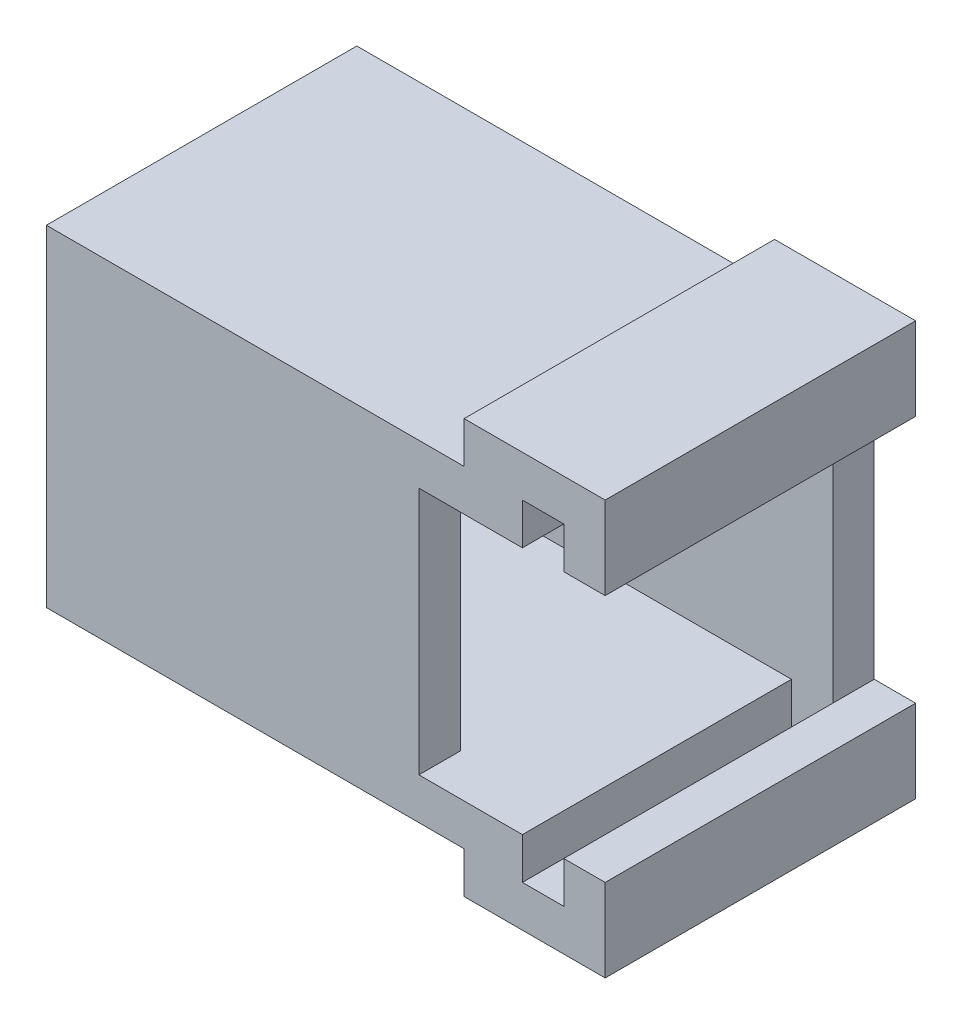
ISO-10303-21;
HEADER;
FILE_DESCRIPTION(('STEP AP214'),'2;1');
FILE_NAME('part.step','',(''),(''),'','','');
FILE_SCHEMA(('AUTOMOTIVE_DESIGN { 1 0 10303 214 1 1 1 1 }'));
ENDSEC;
DATA;
#1=APPLICATION_CONTEXT('core data for automotive mechanical design processes');
#2=APPLICATION_PROTOCOL_DEFINITION('international standard','automotive_design',2000,#1);
#3=PRODUCT_CONTEXT('',#1,'mechanical');
#4=PRODUCT('Part','Part','',(#3));
#5=PRODUCT_RELATED_PRODUCT_CATEGORY('part','',(#4));
#6=PRODUCT_DEFINITION_FORMATION('','',#4);
#7=PRODUCT_DEFINITION_CONTEXT('part definition',#1,'design');
#8=PRODUCT_DEFINITION('design','',#6,#7);
#9=PRODUCT_DEFINITION_SHAPE('','',#8);
#10=(LENGTH_UNIT() NAMED_UNIT(*) SI_UNIT(.MILLI.,.METRE.));
#11=(NAMED_UNIT(*) PLANE_ANGLE_UNIT() SI_UNIT($,.RADIAN.));
#12=(NAMED_UNIT(*) SI_UNIT($,.STERADIAN.) SOLID_ANGLE_UNIT());
#13=UNCERTAINTY_MEASURE_WITH_UNIT(LENGTH_MEASURE(1.E-05),#10,'distance_accuracy_value','');
#14=(GEOMETRIC_REPRESENTATION_CONTEXT(3) GLOBAL_UNCERTAINTY_ASSIGNED_CONTEXT((#13)) GLOBAL_UNIT_ASSIGNED_CONTEXT((#10,
#11,#12)) REPRESENTATION_CONTEXT('',''));
#15=CARTESIAN_POINT('',(0.,0.,0.));
#16=DIRECTION('',(0.,0.,1.));
#17=DIRECTION('',(1.,0.,0.));
#18=AXIS2_PLACEMENT_3D('',#15,#16,#17);
#19=CARTESIAN_POINT('',(23.,0.,15.));
#20=DIRECTION('',(-1.,0.,0.));
#21=DIRECTION('',(0.,0.,1.));
#22=AXIS2_PLACEMENT_3D('',#19,#20,#21);
#23=PLANE('',#22);
#24=DIRECTION('',(0.,1.,0.));
#25=VECTOR('',#24,1.);
#26=CARTESIAN_POINT('',(23.,0.,2.));
#27=LINE('',#26,#25);
#28=CARTESIAN_POINT('',(23.,14.,2.));
#29=VERTEX_POINT('',#28);
#30=CARTESIAN_POINT('',(23.,16.,2.));
#31=VERTEX_POINT('',#30);
#32=EDGE_CURVE('E192',#29,#31,#27,.T.);
#33=ORIENTED_EDGE('',*,*,#32,.T.);
#34=DIRECTION('',(0.,0.,-1.));
#35=VECTOR('',#34,1.);
#36=CARTESIAN_POINT('',(23.,16.,15.));
#37=LINE('',#36,#35);
#38=CARTESIAN_POINT('',(23.,16.,15.));
#39=VERTEX_POINT('',#38);
#40=EDGE_CURVE('E206',#39,#31,#37,.T.);
#41=ORIENTED_EDGE('',*,*,#40,.F.);
#42=DIRECTION('',(0.,1.,0.));
#43=VECTOR('',#42,1.);
#44=CARTESIAN_POINT('',(23.,0.,15.));
#45=LINE('',#44,#43);
#46=CARTESIAN_POINT('',(23.,14.,15.));
#47=VERTEX_POINT('',#46);
#48=EDGE_CURVE('E235',#47,#39,#45,.T.);
#49=ORIENTED_EDGE('',*,*,#48,.F.);
#50=DIRECTION('',(0.,0.,1.));
#51=VECTOR('',#50,1.);
#52=CARTESIAN_POINT('',(23.,14.,13.));
#53=LINE('',#52,#51);
#54=EDGE_CURVE('E208',#29,#47,#53,.T.);
#55=ORIENTED_EDGE('',*,*,#54,.F.);
#56=EDGE_LOOP('',(#33,#41,#49,#55));
#57=FACE_BOUND('',#56,.T.);
#58=ADVANCED_FACE('F33',(#57),#23,.F.);
#59=CARTESIAN_POINT('',(23.,0.,2.));
#60=VERTEX_POINT('',#59);
#61=CARTESIAN_POINT('',(23.,2.,2.));
#62=VERTEX_POINT('',#61);
#63=EDGE_CURVE('E200',#60,#62,#27,.T.);
#64=ORIENTED_EDGE('',*,*,#63,.T.);
#65=DIRECTION('',(0.,0.,-1.));
#66=VECTOR('',#65,1.);
#67=CARTESIAN_POINT('',(23.,2.,13.));
#68=LINE('',#67,#66);
#69=CARTESIAN_POINT('',(23.,2.,15.));
#70=VERTEX_POINT('',#69);
#71=EDGE_CURVE('E252',#70,#62,#68,.T.);
#72=ORIENTED_EDGE('',*,*,#71,.F.);
#73=CARTESIAN_POINT('',(23.,0.,15.));
#74=VERTEX_POINT('',#73);
#75=EDGE_CURVE('E232',#74,#70,#45,.T.);
#76=ORIENTED_EDGE('',*,*,#75,.F.);
#77=DIRECTION('',(0.,0.,-1.));
#78=VECTOR('',#77,1.);
#79=CARTESIAN_POINT('',(23.,0.,15.));
#80=LINE('',#79,#78);
#81=EDGE_CURVE('E42',#74,#60,#80,.T.);
#82=ORIENTED_EDGE('',*,*,#81,.T.);
#83=EDGE_LOOP('',(#64,#72,#76,#82));
#84=FACE_BOUND('',#83,.T.);
#85=ADVANCED_FACE('F375',(#84),#23,.F.);
#86=CARTESIAN_POINT('',(25.,16.,0.));
#87=DIRECTION('',(0.,-1.,0.));
#88=DIRECTION('',(0.,0.,-1.));
#89=AXIS2_PLACEMENT_3D('',#86,#87,#88);
#90=PLANE('',#89);
#91=ORIENTED_EDGE('',*,*,#40,.T.);
#92=DIRECTION('',(1.,0.,0.));
#93=VECTOR('',#92,1.);
#94=CARTESIAN_POINT('',(23.,16.,2.));
#95=LINE('',#94,#93);
#96=CARTESIAN_POINT('',(25.,16.,2.));
#97=VERTEX_POINT('',#96);
#98=EDGE_CURVE('E188',#31,#97,#95,.T.);
#99=ORIENTED_EDGE('',*,*,#98,.T.);
#100=DIRECTION('',(0.,0.,1.));
#101=VECTOR('',#100,1.);
#102=CARTESIAN_POINT('',(25.,16.,0.));
#103=LINE('',#102,#101);
#104=CARTESIAN_POINT('',(25.,16.,15.));
#105=VERTEX_POINT('',#104);
#106=EDGE_CURVE('E285',#97,#105,#103,.T.);
#107=ORIENTED_EDGE('',*,*,#106,.T.);
#108=DIRECTION('',(1.,0.,0.));
#109=VECTOR('',#108,1.);
#110=CARTESIAN_POINT('',(25.,16.,15.));
#111=LINE('',#110,#109);
#112=EDGE_CURVE('E213',#39,#105,#111,.T.);
#113=ORIENTED_EDGE('',*,*,#112,.F.);
#114=EDGE_LOOP('',(#91,#99,#107,#113));
#115=FACE_BOUND('',#114,.T.);
#116=ADVANCED_FACE('F211',(#115),#90,.T.);
#117=CARTESIAN_POINT('',(25.,14.,0.));
#118=DIRECTION('',(-1.,0.,0.));
#119=DIRECTION('',(0.,0.,1.));
#120=AXIS2_PLACEMENT_3D('',#117,#118,#119);
#121=PLANE('',#120);
#122=ORIENTED_EDGE('',*,*,#106,.F.);
#123=DIRECTION('',(0.,-1.,0.));
#124=VECTOR('',#123,1.);
#125=CARTESIAN_POINT('',(25.,0.,2.));
#126=LINE('',#125,#124);
#127=CARTESIAN_POINT('',(25.,14.,2.));
#128=VERTEX_POINT('',#127);
#129=EDGE_CURVE('E195',#97,#128,#126,.T.);
#130=ORIENTED_EDGE('',*,*,#129,.T.);
#131=DIRECTION('',(0.,0.,1.));
#132=VECTOR('',#131,1.);
#133=CARTESIAN_POINT('',(25.,14.,0.));
#134=LINE('',#133,#132);
#135=CARTESIAN_POINT('',(25.,14.,15.));
#136=VERTEX_POINT('',#135);
#137=EDGE_CURVE('E287',#128,#136,#134,.T.);
#138=ORIENTED_EDGE('',*,*,#137,.T.);
#139=DIRECTION('',(0.,-1.,0.));
#140=VECTOR('',#139,1.);
#141=CARTESIAN_POINT('',(25.,14.,15.));
#142=LINE('',#141,#140);
#143=EDGE_CURVE('E312',#105,#136,#142,.T.);
#144=ORIENTED_EDGE('',*,*,#143,.F.);
#145=EDGE_LOOP('',(#122,#130,#138,#144));
#146=FACE_BOUND('',#145,.T.);
#147=ADVANCED_FACE('F412',(#146),#121,.T.);
#148=CARTESIAN_POINT('',(20.1840750883413,0.,0.));
#149=DIRECTION('',(0.,1.,0.));
#150=DIRECTION('',(0.,0.,1.));
#151=AXIS2_PLACEMENT_3D('',#148,#149,#150);
#152=PLANE('',#151);
#153=DIRECTION('',(0.,0.,1.));
#154=VECTOR('',#153,1.);
#155=CARTESIAN_POINT('',(25.,0.,0.));
#156=LINE('',#155,#154);
#157=CARTESIAN_POINT('',(25.,0.,2.));
#158=VERTEX_POINT('',#157);
#159=CARTESIAN_POINT('',(25.,0.,15.));
#160=VERTEX_POINT('',#159);
#161=EDGE_CURVE('E337',#158,#160,#156,.T.);
#162=ORIENTED_EDGE('',*,*,#161,.F.);
#163=DIRECTION('',(-1.,0.,0.));
#164=VECTOR('',#163,1.);
#165=CARTESIAN_POINT('',(23.,0.,2.));
#166=LINE('',#165,#164);
#167=EDGE_CURVE('E359',#158,#60,#166,.T.);
#168=ORIENTED_EDGE('',*,*,#167,.T.);
#169=ORIENTED_EDGE('',*,*,#81,.F.);
#170=DIRECTION('',(-1.,0.,0.));
#171=VECTOR('',#170,1.);
#172=CARTESIAN_POINT('',(20.1840750883413,0.,15.));
#173=LINE('',#172,#171);
#174=EDGE_CURVE('E340',#160,#74,#173,.T.);
#175=ORIENTED_EDGE('',*,*,#174,.F.);
#176=EDGE_LOOP('',(#162,#168,#169,#175));
#177=FACE_BOUND('',#176,.T.);
#178=ADVANCED_FACE('F388',(#177),#152,.T.);
#179=CARTESIAN_POINT('',(25.,2.,0.));
#180=DIRECTION('',(-1.,0.,0.));
#181=DIRECTION('',(0.,-1.,0.));
#182=AXIS2_PLACEMENT_3D('',#179,#180,#181);
#183=PLANE('',#182);
#184=DIRECTION('',(0.,0.,1.));
#185=VECTOR('',#184,1.);
#186=CARTESIAN_POINT('',(25.,2.,0.));
#187=LINE('',#186,#185);
#188=CARTESIAN_POINT('',(25.,2.,2.));
#189=VERTEX_POINT('',#188);
#190=CARTESIAN_POINT('',(25.,2.,15.));
#191=VERTEX_POINT('',#190);
#192=EDGE_CURVE('E333',#189,#191,#187,.T.);
#193=ORIENTED_EDGE('',*,*,#192,.F.);
#194=EDGE_CURVE('E199',#189,#158,#126,.T.);
#195=ORIENTED_EDGE('',*,*,#194,.T.);
#196=ORIENTED_EDGE('',*,*,#161,.T.);
#197=DIRECTION('',(0.,-1.,0.));
#198=VECTOR('',#197,1.);
#199=CARTESIAN_POINT('',(25.,2.,15.));
#200=LINE('',#199,#198);
#201=EDGE_CURVE('E344',#191,#160,#200,.T.);
#202=ORIENTED_EDGE('',*,*,#201,.F.);
#203=EDGE_LOOP('',(#193,#195,#196,#202));
#204=FACE_BOUND('',#203,.T.);
#205=ADVANCED_FACE('F392',(#204),#183,.T.);
#206=CARTESIAN_POINT('',(0.,0.,15.));
#207=DIRECTION('',(1.,0.,0.));
#208=DIRECTION('',(0.,0.,-1.));
#209=AXIS2_PLACEMENT_3D('',#206,#207,#208);
#210=PLANE('',#209);
#211=CARTESIAN_POINT('',(0.,8.,7.5));
#212=DIRECTION('',(-1.,0.,0.));
#213=DIRECTION('',(0.,0.,1.));
#214=AXIS2_PLACEMENT_3D('',#211,#212,#213);
#215=CIRCLE('',#214,4.);
#216=CARTESIAN_POINT('',(0.,8.,11.5));
#217=VERTEX_POINT('',#216);
#218=EDGE_CURVE('E265',#217,#217,#215,.T.);
#219=ORIENTED_EDGE('',*,*,#218,.F.);
#220=EDGE_LOOP('',(#219));
#221=FACE_BOUND('',#220,.T.);
#222=DIRECTION('',(0.,-1.,0.));
#223=VECTOR('',#222,1.);
#224=CARTESIAN_POINT('',(0.,0.,0.));
#225=LINE('',#224,#223);
#226=CARTESIAN_POINT('',(0.,16.,0.));
#227=VERTEX_POINT('',#226);
#228=CARTESIAN_POINT('',(0.,0.,0.));
#229=VERTEX_POINT('',#228);
#230=EDGE_CURVE('E227',#227,#229,#225,.T.);
#231=ORIENTED_EDGE('',*,*,#230,.T.);
#232=DIRECTION('',(0.,0.,-1.));
#233=VECTOR('',#232,1.);
#234=CARTESIAN_POINT('',(0.,0.,15.));
#235=LINE('',#234,#233);
#236=CARTESIAN_POINT('',(0.,0.,15.));
#237=VERTEX_POINT('',#236);
#238=EDGE_CURVE('E11',#237,#229,#235,.T.);
#239=ORIENTED_EDGE('',*,*,#238,.F.);
#240=DIRECTION('',(0.,-1.,0.));
#241=VECTOR('',#240,1.);
#242=CARTESIAN_POINT('',(0.,0.,15.));
#243=LINE('',#242,#241);
#244=CARTESIAN_POINT('',(0.,16.,15.));
#245=VERTEX_POINT('',#244);
#246=EDGE_CURVE('E224',#245,#237,#243,.T.);
#247=ORIENTED_EDGE('',*,*,#246,.F.);
#248=DIRECTION('',(0.,0.,-1.));
#249=VECTOR('',#248,1.);
#250=CARTESIAN_POINT('',(0.,16.,15.));
#251=LINE('',#250,#249);
#252=EDGE_CURVE('E214',#245,#227,#251,.T.);
#253=ORIENTED_EDGE('',*,*,#252,.T.);
#254=EDGE_LOOP('',(#231,#239,#247,#253));
#255=FACE_BOUND('',#254,.T.);
#256=ADVANCED_FACE('F35',(#221,#255),#210,.F.);
#257=CARTESIAN_POINT('',(0.,0.,15.));
#258=DIRECTION('',(0.,1.,0.));
#259=DIRECTION('',(0.,0.,1.));
#260=AXIS2_PLACEMENT_3D('',#257,#258,#259);
#261=PLANE('',#260);
#262=DIRECTION('',(1.,0.,0.));
#263=VECTOR('',#262,1.);
#264=CARTESIAN_POINT('',(0.,0.,0.));
#265=LINE('',#264,#263);
#266=CARTESIAN_POINT('',(20.1840750883413,0.,0.));
#267=VERTEX_POINT('',#266);
#268=EDGE_CURVE('E225',#229,#267,#265,.T.);
#269=ORIENTED_EDGE('',*,*,#268,.T.);
#270=DIRECTION('',(0.,0.,1.));
#271=VECTOR('',#270,1.);
#272=CARTESIAN_POINT('',(20.1840750883413,0.,0.));
#273=LINE('',#272,#271);
#274=CARTESIAN_POINT('',(20.1840750883413,0.,15.));
#275=VERTEX_POINT('',#274);
#276=EDGE_CURVE('E57',#267,#275,#273,.T.);
#277=ORIENTED_EDGE('',*,*,#276,.T.);
#278=DIRECTION('',(1.,0.,0.));
#279=VECTOR('',#278,1.);
#280=CARTESIAN_POINT('',(0.,0.,15.));
#281=LINE('',#280,#279);
#282=EDGE_CURVE('E236',#237,#275,#281,.T.);
#283=ORIENTED_EDGE('',*,*,#282,.F.);
#284=ORIENTED_EDGE('',*,*,#238,.T.);
#285=EDGE_LOOP('',(#269,#277,#283,#284));
#286=FACE_BOUND('',#285,.T.);
#287=ADVANCED_FACE('F448',(#286),#261,.F.);
#288=CARTESIAN_POINT('',(0.,16.,15.));
#289=DIRECTION('',(0.,-1.,0.));
#290=DIRECTION('',(0.,0.,-1.));
#291=AXIS2_PLACEMENT_3D('',#288,#289,#290);
#292=PLANE('',#291);
#293=DIRECTION('',(-1.,0.,0.));
#294=VECTOR('',#293,1.);
#295=CARTESIAN_POINT('',(0.,16.,15.));
#296=LINE('',#295,#294);
#297=CARTESIAN_POINT('',(20.1840750883413,16.,15.));
#298=VERTEX_POINT('',#297);
#299=EDGE_CURVE('E219',#298,#245,#296,.T.);
#300=ORIENTED_EDGE('',*,*,#299,.F.);
#301=DIRECTION('',(0.,0.,1.));
#302=VECTOR('',#301,1.);
#303=CARTESIAN_POINT('',(20.1840750883413,16.,0.));
#304=LINE('',#303,#302);
#305=CARTESIAN_POINT('',(20.1840750883413,16.,0.));
#306=VERTEX_POINT('',#305);
#307=EDGE_CURVE('E282',#306,#298,#304,.T.);
#308=ORIENTED_EDGE('',*,*,#307,.F.);
#309=DIRECTION('',(-1.,0.,0.));
#310=VECTOR('',#309,1.);
#311=CARTESIAN_POINT('',(0.,16.,0.));
#312=LINE('',#311,#310);
#313=EDGE_CURVE('E222',#306,#227,#312,.T.);
#314=ORIENTED_EDGE('',*,*,#313,.T.);
#315=ORIENTED_EDGE('',*,*,#252,.F.);
#316=EDGE_LOOP('',(#300,#308,#314,#315));
#317=FACE_BOUND('',#316,.T.);
#318=ADVANCED_FACE('F446',(#317),#292,.F.);
#319=CARTESIAN_POINT('',(0.,0.,15.));
#320=DIRECTION('',(0.,0.,-1.));
#321=DIRECTION('',(-1.,0.,0.));
#322=AXIS2_PLACEMENT_3D('',#319,#320,#321);
#323=PLANE('',#322);
#324=ORIENTED_EDGE('',*,*,#75,.T.);
#325=DIRECTION('',(1.,0.,0.));
#326=VECTOR('',#325,1.);
#327=CARTESIAN_POINT('',(23.,2.,15.));
#328=LINE('',#327,#326);
#329=CARTESIAN_POINT('',(18.,2.,15.));
#330=VERTEX_POINT('',#329);
#331=EDGE_CURVE('E273',#330,#70,#328,.T.);
#332=ORIENTED_EDGE('',*,*,#331,.F.);
#333=DIRECTION('',(0.,-1.,0.));
#334=VECTOR('',#333,1.);
#335=CARTESIAN_POINT('',(18.,2.,15.));
#336=LINE('',#335,#334);
#337=CARTESIAN_POINT('',(18.,14.,15.));
#338=VERTEX_POINT('',#337);
#339=EDGE_CURVE('E276',#338,#330,#336,.T.);
#340=ORIENTED_EDGE('',*,*,#339,.F.);
#341=DIRECTION('',(-1.,0.,0.));
#342=VECTOR('',#341,1.);
#343=CARTESIAN_POINT('',(23.,14.,15.));
#344=LINE('',#343,#342);
#345=EDGE_CURVE('E279',#47,#338,#344,.T.);
#346=ORIENTED_EDGE('',*,*,#345,.F.);
#347=ORIENTED_EDGE('',*,*,#48,.T.);
#348=ORIENTED_EDGE('',*,*,#112,.T.);
#349=ORIENTED_EDGE('',*,*,#143,.T.);
#350=DIRECTION('',(1.,0.,0.));
#351=VECTOR('',#350,1.);
#352=CARTESIAN_POINT('',(27.,14.,15.));
#353=LINE('',#352,#351);
#354=CARTESIAN_POINT('',(27.,14.,15.));
#355=VERTEX_POINT('',#354);
#356=EDGE_CURVE('E309',#136,#355,#353,.T.);
#357=ORIENTED_EDGE('',*,*,#356,.T.);
#358=DIRECTION('',(0.,1.,0.));
#359=VECTOR('',#358,1.);
#360=CARTESIAN_POINT('',(27.,18.,15.));
#361=LINE('',#360,#359);
#362=CARTESIAN_POINT('',(27.,18.,15.));
#363=VERTEX_POINT('',#362);
#364=EDGE_CURVE('E306',#355,#363,#361,.T.);
#365=ORIENTED_EDGE('',*,*,#364,.T.);
#366=DIRECTION('',(-1.,0.,0.));
#367=VECTOR('',#366,1.);
#368=CARTESIAN_POINT('',(20.1840750883413,18.,15.));
#369=LINE('',#368,#367);
#370=CARTESIAN_POINT('',(20.1840750883413,18.,15.));
#371=VERTEX_POINT('',#370);
#372=EDGE_CURVE('E303',#363,#371,#369,.T.);
#373=ORIENTED_EDGE('',*,*,#372,.T.);
#374=DIRECTION('',(0.,-1.,0.));
#375=VECTOR('',#374,1.);
#376=CARTESIAN_POINT('',(20.1840750883413,16.,15.));
#377=LINE('',#376,#375);
#378=EDGE_CURVE('E299',#371,#298,#377,.T.);
#379=ORIENTED_EDGE('',*,*,#378,.T.);
#380=ORIENTED_EDGE('',*,*,#299,.T.);
#381=ORIENTED_EDGE('',*,*,#246,.T.);
#382=ORIENTED_EDGE('',*,*,#282,.T.);
#383=DIRECTION('',(0.,-1.,0.));
#384=VECTOR('',#383,1.);
#385=CARTESIAN_POINT('',(20.1840750883413,0.,15.));
#386=LINE('',#385,#384);
#387=CARTESIAN_POINT('',(20.1840750883413,-2.,15.));
#388=VERTEX_POINT('',#387);
#389=EDGE_CURVE('E356',#275,#388,#386,.T.);
#390=ORIENTED_EDGE('',*,*,#389,.T.);
#391=DIRECTION('',(1.,0.,0.));
#392=VECTOR('',#391,1.);
#393=CARTESIAN_POINT('',(20.1840750883413,-2.,15.));
#394=LINE('',#393,#392);
#395=CARTESIAN_POINT('',(27.,-2.,15.));
#396=VERTEX_POINT('',#395);
#397=EDGE_CURVE('E353',#388,#396,#394,.T.);
#398=ORIENTED_EDGE('',*,*,#397,.T.);
#399=DIRECTION('',(0.,1.,0.));
#400=VECTOR('',#399,1.);
#401=CARTESIAN_POINT('',(27.,-2.,15.));
#402=LINE('',#401,#400);
#403=CARTESIAN_POINT('',(27.,2.,15.));
#404=VERTEX_POINT('',#403);
#405=EDGE_CURVE('E350',#396,#404,#402,.T.);
#406=ORIENTED_EDGE('',*,*,#405,.T.);
#407=DIRECTION('',(-1.,0.,0.));
#408=VECTOR('',#407,1.);
#409=CARTESIAN_POINT('',(27.,2.,15.));
#410=LINE('',#409,#408);
#411=EDGE_CURVE('E347',#404,#191,#410,.T.);
#412=ORIENTED_EDGE('',*,*,#411,.T.);
#413=ORIENTED_EDGE('',*,*,#201,.T.);
#414=ORIENTED_EDGE('',*,*,#174,.T.);
#415=EDGE_LOOP('',(#324,#332,#340,#346,#347,#348,#349,#357,#365,#373,#379,#380,#381,#382,#390,
#398,#406,#412,#413,#414));
#416=FACE_BOUND('',#415,.T.);
#417=ADVANCED_FACE('F384',(#416),#323,.F.);
#418=CARTESIAN_POINT('',(0.,0.,0.));
#419=DIRECTION('',(0.,0.,-1.));
#420=DIRECTION('',(-1.,0.,0.));
#421=AXIS2_PLACEMENT_3D('',#418,#419,#420);
#422=PLANE('',#421);
#423=DIRECTION('',(1.,0.,0.));
#424=VECTOR('',#423,1.);
#425=CARTESIAN_POINT('',(27.,14.,0.));
#426=LINE('',#425,#424);
#427=CARTESIAN_POINT('',(25.,14.,0.));
#428=VERTEX_POINT('',#427);
#429=CARTESIAN_POINT('',(27.,14.,0.));
#430=VERTEX_POINT('',#429);
#431=EDGE_CURVE('E302',#428,#430,#426,.T.);
#432=ORIENTED_EDGE('',*,*,#431,.F.);
#433=DIRECTION('',(0.,-1.,0.));
#434=VECTOR('',#433,1.);
#435=CARTESIAN_POINT('',(25.,0.,0.));
#436=LINE('',#435,#434);
#437=CARTESIAN_POINT('',(25.,2.,0.));
#438=VERTEX_POINT('',#437);
#439=EDGE_CURVE('E209',#428,#438,#436,.T.);
#440=ORIENTED_EDGE('',*,*,#439,.T.);
#441=DIRECTION('',(-1.,0.,0.));
#442=VECTOR('',#441,1.);
#443=CARTESIAN_POINT('',(27.,2.,0.));
#444=LINE('',#443,#442);
#445=CARTESIAN_POINT('',(27.,2.,0.));
#446=VERTEX_POINT('',#445);
#447=EDGE_CURVE('E329',#446,#438,#444,.T.);
#448=ORIENTED_EDGE('',*,*,#447,.F.);
#449=DIRECTION('',(0.,1.,0.));
#450=VECTOR('',#449,1.);
#451=CARTESIAN_POINT('',(27.,-2.,0.));
#452=LINE('',#451,#450);
#453=CARTESIAN_POINT('',(27.,-2.,0.));
#454=VERTEX_POINT('',#453);
#455=EDGE_CURVE('E362',#454,#446,#452,.T.);
#456=ORIENTED_EDGE('',*,*,#455,.F.);
#457=DIRECTION('',(1.,0.,0.));
#458=VECTOR('',#457,1.);
#459=CARTESIAN_POINT('',(20.1840750883413,-2.,0.));
#460=LINE('',#459,#458);
#461=CARTESIAN_POINT('',(20.1840750883413,-2.,0.));
#462=VERTEX_POINT('',#461);
#463=EDGE_CURVE('E365',#462,#454,#460,.T.);
#464=ORIENTED_EDGE('',*,*,#463,.F.);
#465=DIRECTION('',(0.,-1.,0.));
#466=VECTOR('',#465,1.);
#467=CARTESIAN_POINT('',(20.1840750883413,0.,0.));
#468=LINE('',#467,#466);
#469=EDGE_CURVE('E343',#267,#462,#468,.T.);
#470=ORIENTED_EDGE('',*,*,#469,.F.);
#471=ORIENTED_EDGE('',*,*,#268,.F.);
#472=ORIENTED_EDGE('',*,*,#230,.F.);
#473=ORIENTED_EDGE('',*,*,#313,.F.);
#474=DIRECTION('',(0.,-1.,0.));
#475=VECTOR('',#474,1.);
#476=CARTESIAN_POINT('',(20.1840750883413,16.,0.));
#477=LINE('',#476,#475);
#478=CARTESIAN_POINT('',(20.1840750883413,18.,0.));
#479=VERTEX_POINT('',#478);
#480=EDGE_CURVE('E288',#479,#306,#477,.T.);
#481=ORIENTED_EDGE('',*,*,#480,.F.);
#482=DIRECTION('',(-1.,0.,0.));
#483=VECTOR('',#482,1.);
#484=CARTESIAN_POINT('',(20.1840750883413,18.,0.));
#485=LINE('',#484,#483);
#486=CARTESIAN_POINT('',(27.,18.,0.));
#487=VERTEX_POINT('',#486);
#488=EDGE_CURVE('E318',#487,#479,#485,.T.);
#489=ORIENTED_EDGE('',*,*,#488,.F.);
#490=DIRECTION('',(0.,1.,0.));
#491=VECTOR('',#490,1.);
#492=CARTESIAN_POINT('',(27.,18.,0.));
#493=LINE('',#492,#491);
#494=EDGE_CURVE('E321',#430,#487,#493,.T.);
#495=ORIENTED_EDGE('',*,*,#494,.F.);
#496=EDGE_LOOP('',(#432,#440,#448,#456,#464,#470,#471,#472,#473,#481,#489,#495));
#497=FACE_BOUND('',#496,.T.);
#498=ADVANCED_FACE('F402',(#497),#422,.T.);
#499=CARTESIAN_POINT('',(2.,2.,13.));
#500=DIRECTION('',(0.,0.,1.));
#501=DIRECTION('',(1.,0.,0.));
#502=AXIS2_PLACEMENT_3D('',#499,#500,#501);
#503=PLANE('',#502);
#504=DIRECTION('',(1.,0.,0.));
#505=VECTOR('',#504,1.);
#506=CARTESIAN_POINT('',(2.,14.,13.));
#507=LINE('',#506,#505);
#508=CARTESIAN_POINT('',(2.,14.,13.));
#509=VERTEX_POINT('',#508);
#510=CARTESIAN_POINT('',(18.,14.,13.));
#511=VERTEX_POINT('',#510);
#512=EDGE_CURVE('E230',#509,#511,#507,.T.);
#513=ORIENTED_EDGE('',*,*,#512,.T.);
#514=DIRECTION('',(0.,-1.,0.));
#515=VECTOR('',#514,1.);
#516=CARTESIAN_POINT('',(18.,2.,13.));
#517=LINE('',#516,#515);
#518=CARTESIAN_POINT('',(18.,2.,13.));
#519=VERTEX_POINT('',#518);
#520=EDGE_CURVE('E271',#511,#519,#517,.T.);
#521=ORIENTED_EDGE('',*,*,#520,.T.);
#522=DIRECTION('',(1.,0.,0.));
#523=VECTOR('',#522,1.);
#524=CARTESIAN_POINT('',(2.,2.,13.));
#525=LINE('',#524,#523);
#526=CARTESIAN_POINT('',(2.,2.,13.));
#527=VERTEX_POINT('',#526);
#528=EDGE_CURVE('E240',#527,#519,#525,.T.);
#529=ORIENTED_EDGE('',*,*,#528,.F.);
#530=DIRECTION('',(0.,-1.,0.));
#531=VECTOR('',#530,1.);
#532=CARTESIAN_POINT('',(2.,2.,13.));
#533=LINE('',#532,#531);
#534=EDGE_CURVE('E251',#509,#527,#533,.T.);
#535=ORIENTED_EDGE('',*,*,#534,.F.);
#536=EDGE_LOOP('',(#513,#521,#529,#535));
#537=FACE_BOUND('',#536,.T.);
#538=ADVANCED_FACE('F423',(#537),#503,.F.);
#539=CARTESIAN_POINT('',(2.,14.,13.));
#540=DIRECTION('',(0.,1.,0.));
#541=DIRECTION('',(0.,0.,1.));
#542=AXIS2_PLACEMENT_3D('',#539,#540,#541);
#543=PLANE('',#542);
#544=ORIENTED_EDGE('',*,*,#54,.T.);
#545=ORIENTED_EDGE('',*,*,#345,.T.);
#546=DIRECTION('',(0.,0.,1.));
#547=VECTOR('',#546,1.);
#548=CARTESIAN_POINT('',(18.,14.,13.));
#549=LINE('',#548,#547);
#550=EDGE_CURVE('E269',#511,#338,#549,.T.);
#551=ORIENTED_EDGE('',*,*,#550,.F.);
#552=ORIENTED_EDGE('',*,*,#512,.F.);
#553=DIRECTION('',(0.,0.,1.));
#554=VECTOR('',#553,1.);
#555=CARTESIAN_POINT('',(2.,14.,13.));
#556=LINE('',#555,#554);
#557=CARTESIAN_POINT('',(2.,14.,2.));
#558=VERTEX_POINT('',#557);
#559=EDGE_CURVE('E244',#558,#509,#556,.T.);
#560=ORIENTED_EDGE('',*,*,#559,.F.);
#561=DIRECTION('',(1.,0.,0.));
#562=VECTOR('',#561,1.);
#563=CARTESIAN_POINT('',(2.,14.,2.));
#564=LINE('',#563,#562);
#565=EDGE_CURVE('E246',#558,#29,#564,.T.);
#566=ORIENTED_EDGE('',*,*,#565,.T.);
#567=EDGE_LOOP('',(#544,#545,#551,#552,#560,#566));
#568=FACE_BOUND('',#567,.T.);
#569=ADVANCED_FACE('F416',(#568),#543,.F.);
#570=CARTESIAN_POINT('',(2.,2.,2.));
#571=DIRECTION('',(0.,0.,-1.));
#572=DIRECTION('',(-1.,0.,0.));
#573=AXIS2_PLACEMENT_3D('',#570,#571,#572);
#574=PLANE('',#573);
#575=DIRECTION('',(1.,0.,0.));
#576=VECTOR('',#575,1.);
#577=CARTESIAN_POINT('',(2.,2.,2.));
#578=LINE('',#577,#576);
#579=CARTESIAN_POINT('',(2.,2.,2.));
#580=VERTEX_POINT('',#579);
#581=EDGE_CURVE('E243',#580,#62,#578,.T.);
#582=ORIENTED_EDGE('',*,*,#581,.T.);
#583=ORIENTED_EDGE('',*,*,#63,.F.);
#584=ORIENTED_EDGE('',*,*,#167,.F.);
#585=ORIENTED_EDGE('',*,*,#194,.F.);
#586=EDGE_CURVE('E49',#128,#189,#126,.T.);
#587=ORIENTED_EDGE('',*,*,#586,.F.);
#588=ORIENTED_EDGE('',*,*,#129,.F.);
#589=ORIENTED_EDGE('',*,*,#98,.F.);
#590=ORIENTED_EDGE('',*,*,#32,.F.);
#591=ORIENTED_EDGE('',*,*,#565,.F.);
#592=DIRECTION('',(0.,1.,0.));
#593=VECTOR('',#592,1.);
#594=CARTESIAN_POINT('',(2.,2.,2.));
#595=LINE('',#594,#593);
#596=EDGE_CURVE('E257',#580,#558,#595,.T.);
#597=ORIENTED_EDGE('',*,*,#596,.F.);
#598=EDGE_LOOP('',(#582,#583,#584,#585,#587,#588,#589,#590,#591,#597));
#599=FACE_BOUND('',#598,.T.);
#600=ADVANCED_FACE('F191',(#599),#574,.F.);
#601=CARTESIAN_POINT('',(2.,2.,13.));
#602=DIRECTION('',(0.,-1.,0.));
#603=DIRECTION('',(0.,0.,-1.));
#604=AXIS2_PLACEMENT_3D('',#601,#602,#603);
#605=PLANE('',#604);
#606=ORIENTED_EDGE('',*,*,#71,.T.);
#607=ORIENTED_EDGE('',*,*,#581,.F.);
#608=DIRECTION('',(0.,0.,-1.));
#609=VECTOR('',#608,1.);
#610=CARTESIAN_POINT('',(2.,2.,13.));
#611=LINE('',#610,#609);
#612=EDGE_CURVE('E260',#527,#580,#611,.T.);
#613=ORIENTED_EDGE('',*,*,#612,.F.);
#614=ORIENTED_EDGE('',*,*,#528,.T.);
#615=DIRECTION('',(0.,0.,1.));
#616=VECTOR('',#615,1.);
#617=CARTESIAN_POINT('',(18.,2.,13.));
#618=LINE('',#617,#616);
#619=EDGE_CURVE('E268',#519,#330,#618,.T.);
#620=ORIENTED_EDGE('',*,*,#619,.T.);
#621=ORIENTED_EDGE('',*,*,#331,.T.);
#622=EDGE_LOOP('',(#606,#607,#613,#614,#620,#621));
#623=FACE_BOUND('',#622,.T.);
#624=ADVANCED_FACE('F380',(#623),#605,.F.);
#625=CARTESIAN_POINT('',(2.,0.,0.));
#626=DIRECTION('',(-1.,0.,0.));
#627=DIRECTION('',(0.,0.,1.));
#628=AXIS2_PLACEMENT_3D('',#625,#626,#627);
#629=PLANE('',#628);
#630=CARTESIAN_POINT('',(2.,8.,7.5));
#631=DIRECTION('',(-1.,0.,0.));
#632=DIRECTION('',(0.,0.,1.));
#633=AXIS2_PLACEMENT_3D('',#630,#631,#632);
#634=CIRCLE('',#633,4.);
#635=CARTESIAN_POINT('',(2.,8.,11.5));
#636=VERTEX_POINT('',#635);
#637=EDGE_CURVE('E37',#636,#636,#634,.T.);
#638=ORIENTED_EDGE('',*,*,#637,.T.);
#639=EDGE_LOOP('',(#638));
#640=FACE_BOUND('',#639,.T.);
#641=ORIENTED_EDGE('',*,*,#534,.T.);
#642=ORIENTED_EDGE('',*,*,#612,.T.);
#643=ORIENTED_EDGE('',*,*,#596,.T.);
#644=ORIENTED_EDGE('',*,*,#559,.T.);
#645=EDGE_LOOP('',(#641,#642,#643,#644));
#646=FACE_BOUND('',#645,.T.);
#647=ADVANCED_FACE('F420',(#640,#646),#629,.F.);
#648=CARTESIAN_POINT('',(23.,8.,7.5));
#649=DIRECTION('',(-1.,0.,0.));
#650=DIRECTION('',(0.,0.,1.));
#651=AXIS2_PLACEMENT_3D('',#648,#649,#650);
#652=CYLINDRICAL_SURFACE('',#651,4.);
#653=ORIENTED_EDGE('',*,*,#218,.T.);
#654=EDGE_LOOP('',(#653));
#655=FACE_BOUND('',#654,.T.);
#656=ORIENTED_EDGE('',*,*,#637,.F.);
#657=EDGE_LOOP('',(#656));
#658=FACE_BOUND('',#657,.T.);
#659=ADVANCED_FACE('F428',(#655,#658),#652,.F.);
#660=CARTESIAN_POINT('',(18.,2.,13.));
#661=DIRECTION('',(-1.,0.,0.));
#662=DIRECTION('',(0.,-1.,0.));
#663=AXIS2_PLACEMENT_3D('',#660,#661,#662);
#664=PLANE('',#663);
#665=ORIENTED_EDGE('',*,*,#339,.T.);
#666=ORIENTED_EDGE('',*,*,#619,.F.);
#667=ORIENTED_EDGE('',*,*,#520,.F.);
#668=ORIENTED_EDGE('',*,*,#550,.T.);
#669=EDGE_LOOP('',(#665,#666,#667,#668));
#670=FACE_BOUND('',#669,.T.);
#671=ADVANCED_FACE('F425',(#670),#664,.F.);
#672=CARTESIAN_POINT('',(20.1840750883413,16.,0.));
#673=DIRECTION('',(-1.,0.,0.));
#674=DIRECTION('',(0.,0.,1.));
#675=AXIS2_PLACEMENT_3D('',#672,#673,#674);
#676=PLANE('',#675);
#677=ORIENTED_EDGE('',*,*,#378,.F.);
#678=DIRECTION('',(0.,0.,1.));
#679=VECTOR('',#678,1.);
#680=CARTESIAN_POINT('',(20.1840750883413,18.,0.));
#681=LINE('',#680,#679);
#682=EDGE_CURVE('E295',#479,#371,#681,.T.);
#683=ORIENTED_EDGE('',*,*,#682,.F.);
#684=ORIENTED_EDGE('',*,*,#480,.T.);
#685=ORIENTED_EDGE('',*,*,#307,.T.);
#686=EDGE_LOOP('',(#677,#683,#684,#685));
#687=FACE_BOUND('',#686,.T.);
#688=ADVANCED_FACE('F427',(#687),#676,.T.);
#689=CARTESIAN_POINT('',(20.1840750883413,18.,0.));
#690=DIRECTION('',(0.,1.,0.));
#691=DIRECTION('',(0.,0.,1.));
#692=AXIS2_PLACEMENT_3D('',#689,#690,#691);
#693=PLANE('',#692);
#694=ORIENTED_EDGE('',*,*,#372,.F.);
#695=DIRECTION('',(0.,0.,1.));
#696=VECTOR('',#695,1.);
#697=CARTESIAN_POINT('',(27.,18.,0.));
#698=LINE('',#697,#696);
#699=EDGE_CURVE('E293',#487,#363,#698,.T.);
#700=ORIENTED_EDGE('',*,*,#699,.F.);
#701=ORIENTED_EDGE('',*,*,#488,.T.);
#702=ORIENTED_EDGE('',*,*,#682,.T.);
#703=EDGE_LOOP('',(#694,#700,#701,#702));
#704=FACE_BOUND('',#703,.T.);
#705=ADVANCED_FACE('F434',(#704),#693,.T.);
#706=CARTESIAN_POINT('',(27.,18.,0.));
#707=DIRECTION('',(1.,0.,0.));
#708=DIRECTION('',(0.,0.,-1.));
#709=AXIS2_PLACEMENT_3D('',#706,#707,#708);
#710=PLANE('',#709);
#711=ORIENTED_EDGE('',*,*,#364,.F.);
#712=DIRECTION('',(0.,0.,1.));
#713=VECTOR('',#712,1.);
#714=CARTESIAN_POINT('',(27.,14.,0.));
#715=LINE('',#714,#713);
#716=EDGE_CURVE('E291',#430,#355,#715,.T.);
#717=ORIENTED_EDGE('',*,*,#716,.F.);
#718=ORIENTED_EDGE('',*,*,#494,.T.);
#719=ORIENTED_EDGE('',*,*,#699,.T.);
#720=EDGE_LOOP('',(#711,#717,#718,#719));
#721=FACE_BOUND('',#720,.T.);
#722=ADVANCED_FACE('F476',(#721),#710,.T.);
#723=CARTESIAN_POINT('',(27.,14.,0.));
#724=DIRECTION('',(0.,-1.,0.));
#725=DIRECTION('',(0.,0.,-1.));
#726=AXIS2_PLACEMENT_3D('',#723,#724,#725);
#727=PLANE('',#726);
#728=ORIENTED_EDGE('',*,*,#356,.F.);
#729=ORIENTED_EDGE('',*,*,#137,.F.);
#730=EDGE_CURVE('E289',#428,#128,#134,.T.);
#731=ORIENTED_EDGE('',*,*,#730,.F.);
#732=ORIENTED_EDGE('',*,*,#431,.T.);
#733=ORIENTED_EDGE('',*,*,#716,.T.);
#734=EDGE_LOOP('',(#728,#729,#731,#732,#733));
#735=FACE_BOUND('',#734,.T.);
#736=ADVANCED_FACE('F408',(#735),#727,.T.);
#737=CARTESIAN_POINT('',(20.1840750883413,0.,0.));
#738=DIRECTION('',(-1.,0.,0.));
#739=DIRECTION('',(0.,0.,1.));
#740=AXIS2_PLACEMENT_3D('',#737,#738,#739);
#741=PLANE('',#740);
#742=ORIENTED_EDGE('',*,*,#389,.F.);
#743=ORIENTED_EDGE('',*,*,#276,.F.);
#744=ORIENTED_EDGE('',*,*,#469,.T.);
#745=DIRECTION('',(0.,0.,1.));
#746=VECTOR('',#745,1.);
#747=CARTESIAN_POINT('',(20.1840750883413,-2.,0.));
#748=LINE('',#747,#746);
#749=EDGE_CURVE('E326',#462,#388,#748,.T.);
#750=ORIENTED_EDGE('',*,*,#749,.T.);
#751=EDGE_LOOP('',(#742,#743,#744,#750));
#752=FACE_BOUND('',#751,.T.);
#753=ADVANCED_FACE('F461',(#752),#741,.T.);
#754=CARTESIAN_POINT('',(27.,2.,0.));
#755=DIRECTION('',(0.,1.,0.));
#756=DIRECTION('',(0.,0.,1.));
#757=AXIS2_PLACEMENT_3D('',#754,#755,#756);
#758=PLANE('',#757);
#759=ORIENTED_EDGE('',*,*,#411,.F.);
#760=DIRECTION('',(0.,0.,1.));
#761=VECTOR('',#760,1.);
#762=CARTESIAN_POINT('',(27.,2.,0.));
#763=LINE('',#762,#761);
#764=EDGE_CURVE('E331',#446,#404,#763,.T.);
#765=ORIENTED_EDGE('',*,*,#764,.F.);
#766=ORIENTED_EDGE('',*,*,#447,.T.);
#767=EDGE_CURVE('E334',#438,#189,#187,.T.);
#768=ORIENTED_EDGE('',*,*,#767,.T.);
#769=ORIENTED_EDGE('',*,*,#192,.T.);
#770=EDGE_LOOP('',(#759,#765,#766,#768,#769));
#771=FACE_BOUND('',#770,.T.);
#772=ADVANCED_FACE('F396',(#771),#758,.T.);
#773=CARTESIAN_POINT('',(27.,-2.,0.));
#774=DIRECTION('',(1.,0.,0.));
#775=DIRECTION('',(0.,0.,-1.));
#776=AXIS2_PLACEMENT_3D('',#773,#774,#775);
#777=PLANE('',#776);
#778=ORIENTED_EDGE('',*,*,#405,.F.);
#779=DIRECTION('',(0.,0.,1.));
#780=VECTOR('',#779,1.);
#781=CARTESIAN_POINT('',(27.,-2.,0.));
#782=LINE('',#781,#780);
#783=EDGE_CURVE('E328',#454,#396,#782,.T.);
#784=ORIENTED_EDGE('',*,*,#783,.F.);
#785=ORIENTED_EDGE('',*,*,#455,.T.);
#786=ORIENTED_EDGE('',*,*,#764,.T.);
#787=EDGE_LOOP('',(#778,#784,#785,#786));
#788=FACE_BOUND('',#787,.T.);
#789=ADVANCED_FACE('F602',(#788),#777,.T.);
#790=CARTESIAN_POINT('',(20.1840750883413,-2.,0.));
#791=DIRECTION('',(0.,-1.,0.));
#792=DIRECTION('',(0.,0.,-1.));
#793=AXIS2_PLACEMENT_3D('',#790,#791,#792);
#794=PLANE('',#793);
#795=ORIENTED_EDGE('',*,*,#397,.F.);
#796=ORIENTED_EDGE('',*,*,#749,.F.);
#797=ORIENTED_EDGE('',*,*,#463,.T.);
#798=ORIENTED_EDGE('',*,*,#783,.T.);
#799=EDGE_LOOP('',(#795,#796,#797,#798));
#800=FACE_BOUND('',#799,.T.);
#801=ADVANCED_FACE('F465',(#800),#794,.T.);
#802=CARTESIAN_POINT('',(25.,0.,2.));
#803=DIRECTION('',(1.,0.,0.));
#804=DIRECTION('',(0.,0.,-1.));
#805=AXIS2_PLACEMENT_3D('',#802,#803,#804);
#806=PLANE('',#805);
#807=ORIENTED_EDGE('',*,*,#439,.F.);
#808=ORIENTED_EDGE('',*,*,#730,.T.);
#809=ORIENTED_EDGE('',*,*,#586,.T.);
#810=ORIENTED_EDGE('',*,*,#767,.F.);
#811=EDGE_LOOP('',(#807,#808,#809,#810));
#812=FACE_BOUND('',#811,.T.);
#813=ADVANCED_FACE('F398',(#812),#806,.T.);
#814=CLOSED_SHELL('',(#58,#85,#116,#147,#178,#205,#256,#287,#318,#417,#498,#538,#569,#600,#624,
#647,#659,#671,#688,#705,#722,#736,#753,#772,#789,#801,#813));
#815=MANIFOLD_SOLID_BREP('B2',#814);
#816=ADVANCED_BREP_SHAPE_REPRESENTATION('',(#18,#815),#14);
#817=SHAPE_DEFINITION_REPRESENTATION(#9,#816);
ENDSEC;
END-ISO-10303-21;
